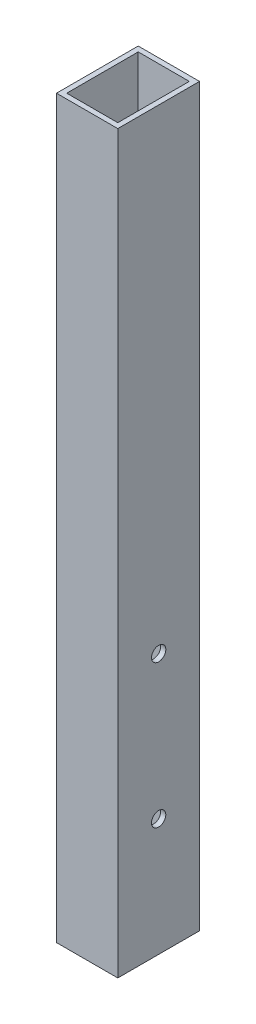
ISO-10303-21;
HEADER;
FILE_DESCRIPTION(('STEP AP214'),'2;1');
FILE_NAME('part.step','',(''),(''),'','','');
FILE_SCHEMA(('AUTOMOTIVE_DESIGN { 1 0 10303 214 1 1 1 1 }'));
ENDSEC;
DATA;
#1=APPLICATION_CONTEXT('core data for automotive mechanical design processes');
#2=APPLICATION_PROTOCOL_DEFINITION('international standard','automotive_design',2000,#1);
#3=PRODUCT_CONTEXT('',#1,'mechanical');
#4=PRODUCT('Part','Part','',(#3));
#5=PRODUCT_RELATED_PRODUCT_CATEGORY('part','',(#4));
#6=PRODUCT_DEFINITION_FORMATION('','',#4);
#7=PRODUCT_DEFINITION_CONTEXT('part definition',#1,'design');
#8=PRODUCT_DEFINITION('design','',#6,#7);
#9=PRODUCT_DEFINITION_SHAPE('','',#8);
#10=(LENGTH_UNIT() NAMED_UNIT(*) SI_UNIT(.MILLI.,.METRE.));
#11=(NAMED_UNIT(*) PLANE_ANGLE_UNIT() SI_UNIT($,.RADIAN.));
#12=(NAMED_UNIT(*) SI_UNIT($,.STERADIAN.) SOLID_ANGLE_UNIT());
#13=UNCERTAINTY_MEASURE_WITH_UNIT(LENGTH_MEASURE(1.E-05),#10,'distance_accuracy_value','');
#14=(GEOMETRIC_REPRESENTATION_CONTEXT(3) GLOBAL_UNCERTAINTY_ASSIGNED_CONTEXT((#13)) GLOBAL_UNIT_ASSIGNED_CONTEXT((#10,
#11,#12)) REPRESENTATION_CONTEXT('',''));
#15=CARTESIAN_POINT('',(0.,0.,0.));
#16=DIRECTION('',(0.,0.,1.));
#17=DIRECTION('',(1.,0.,0.));
#18=AXIS2_PLACEMENT_3D('',#15,#16,#17);
#19=CARTESIAN_POINT('',(38.1,914.4,50.8));
#20=DIRECTION('',(-1.,0.,0.));
#21=DIRECTION('',(0.,0.,1.));
#22=AXIS2_PLACEMENT_3D('',#19,#20,#21);
#23=PLANE('',#22);
#24=CARTESIAN_POINT('',(38.1,146.05,0.));
#25=DIRECTION('',(-1.,0.,0.));
#26=DIRECTION('',(0.,0.,1.));
#27=AXIS2_PLACEMENT_3D('',#24,#25,#26);
#28=CIRCLE('',#27,8.89);
#29=CARTESIAN_POINT('',(38.1,146.05,8.89));
#30=VERTEX_POINT('',#29);
#31=EDGE_CURVE('E213',#30,#30,#28,.T.);
#32=ORIENTED_EDGE('',*,*,#31,.T.);
#33=EDGE_LOOP('',(#32));
#34=FACE_BOUND('',#33,.T.);
#35=CARTESIAN_POINT('',(38.1,323.85,0.));
#36=DIRECTION('',(-1.,0.,0.));
#37=DIRECTION('',(0.,0.,1.));
#38=AXIS2_PLACEMENT_3D('',#35,#36,#37);
#39=CIRCLE('',#38,8.89);
#40=CARTESIAN_POINT('',(38.1,323.85,8.89));
#41=VERTEX_POINT('',#40);
#42=EDGE_CURVE('E226',#41,#41,#39,.T.);
#43=ORIENTED_EDGE('',*,*,#42,.T.);
#44=EDGE_LOOP('',(#43));
#45=FACE_BOUND('',#44,.T.);
#46=DIRECTION('',(0.,0.,-1.));
#47=VECTOR('',#46,1.);
#48=CARTESIAN_POINT('',(38.1,0.,50.8));
#49=LINE('',#48,#47);
#50=CARTESIAN_POINT('',(38.1,0.,50.8));
#51=VERTEX_POINT('',#50);
#52=CARTESIAN_POINT('',(38.1,0.,-50.8));
#53=VERTEX_POINT('',#52);
#54=EDGE_CURVE('E168',#51,#53,#49,.T.);
#55=ORIENTED_EDGE('',*,*,#54,.T.);
#56=DIRECTION('',(0.,-1.,0.));
#57=VECTOR('',#56,1.);
#58=CARTESIAN_POINT('',(38.1,914.4,-50.8));
#59=LINE('',#58,#57);
#60=CARTESIAN_POINT('',(38.1,914.4,-50.8));
#61=VERTEX_POINT('',#60);
#62=EDGE_CURVE('E13',#61,#53,#59,.T.);
#63=ORIENTED_EDGE('',*,*,#62,.F.);
#64=DIRECTION('',(0.,0.,-1.));
#65=VECTOR('',#64,1.);
#66=CARTESIAN_POINT('',(38.1,914.4,50.8));
#67=LINE('',#66,#65);
#68=CARTESIAN_POINT('',(38.1,914.4,50.8));
#69=VERTEX_POINT('',#68);
#70=EDGE_CURVE('E174',#69,#61,#67,.T.);
#71=ORIENTED_EDGE('',*,*,#70,.F.);
#72=DIRECTION('',(0.,-1.,0.));
#73=VECTOR('',#72,1.);
#74=CARTESIAN_POINT('',(38.1,914.4,50.8));
#75=LINE('',#74,#73);
#76=EDGE_CURVE('E188',#69,#51,#75,.T.);
#77=ORIENTED_EDGE('',*,*,#76,.T.);
#78=EDGE_LOOP('',(#55,#63,#71,#77));
#79=FACE_BOUND('',#78,.T.);
#80=ADVANCED_FACE('F55',(#34,#45,#79),#23,.F.);
#81=CARTESIAN_POINT('',(-38.1,914.4,-50.8));
#82=DIRECTION('',(0.,0.,1.));
#83=DIRECTION('',(1.,0.,0.));
#84=AXIS2_PLACEMENT_3D('',#81,#82,#83);
#85=PLANE('',#84);
#86=DIRECTION('',(-1.,0.,0.));
#87=VECTOR('',#86,1.);
#88=CARTESIAN_POINT('',(-38.1,0.,-50.8));
#89=LINE('',#88,#87);
#90=CARTESIAN_POINT('',(-38.1,0.,-50.8));
#91=VERTEX_POINT('',#90);
#92=EDGE_CURVE('E192',#53,#91,#89,.T.);
#93=ORIENTED_EDGE('',*,*,#92,.T.);
#94=DIRECTION('',(0.,-1.,0.));
#95=VECTOR('',#94,1.);
#96=CARTESIAN_POINT('',(-38.1,914.4,-50.8));
#97=LINE('',#96,#95);
#98=CARTESIAN_POINT('',(-38.1,914.4,-50.8));
#99=VERTEX_POINT('',#98);
#100=EDGE_CURVE('E64',#99,#91,#97,.T.);
#101=ORIENTED_EDGE('',*,*,#100,.F.);
#102=DIRECTION('',(-1.,0.,0.));
#103=VECTOR('',#102,1.);
#104=CARTESIAN_POINT('',(-38.1,914.4,-50.8));
#105=LINE('',#104,#103);
#106=EDGE_CURVE('E178',#61,#99,#105,.T.);
#107=ORIENTED_EDGE('',*,*,#106,.F.);
#108=ORIENTED_EDGE('',*,*,#62,.T.);
#109=EDGE_LOOP('',(#93,#101,#107,#108));
#110=FACE_BOUND('',#109,.T.);
#111=ADVANCED_FACE('F244',(#110),#85,.F.);
#112=CARTESIAN_POINT('',(-38.1,914.4,50.8));
#113=DIRECTION('',(1.,0.,0.));
#114=DIRECTION('',(0.,0.,-1.));
#115=AXIS2_PLACEMENT_3D('',#112,#113,#114);
#116=PLANE('',#115);
#117=CARTESIAN_POINT('',(-38.1,146.05,0.));
#118=DIRECTION('',(-1.,0.,0.));
#119=DIRECTION('',(0.,0.,1.));
#120=AXIS2_PLACEMENT_3D('',#117,#118,#119);
#121=CIRCLE('',#120,8.89);
#122=CARTESIAN_POINT('',(-38.1,146.05,8.89));
#123=VERTEX_POINT('',#122);
#124=EDGE_CURVE('E220',#123,#123,#121,.T.);
#125=ORIENTED_EDGE('',*,*,#124,.F.);
#126=EDGE_LOOP('',(#125));
#127=FACE_BOUND('',#126,.T.);
#128=CARTESIAN_POINT('',(-38.1,323.85,0.));
#129=DIRECTION('',(-1.,0.,0.));
#130=DIRECTION('',(0.,0.,1.));
#131=AXIS2_PLACEMENT_3D('',#128,#129,#130);
#132=CIRCLE('',#131,8.89);
#133=CARTESIAN_POINT('',(-38.1,323.85,8.89));
#134=VERTEX_POINT('',#133);
#135=EDGE_CURVE('E232',#134,#134,#132,.T.);
#136=ORIENTED_EDGE('',*,*,#135,.F.);
#137=EDGE_LOOP('',(#136));
#138=FACE_BOUND('',#137,.T.);
#139=DIRECTION('',(0.,0.,1.));
#140=VECTOR('',#139,1.);
#141=CARTESIAN_POINT('',(-38.1,0.,50.8));
#142=LINE('',#141,#140);
#143=CARTESIAN_POINT('',(-38.1,0.,50.8));
#144=VERTEX_POINT('',#143);
#145=EDGE_CURVE('E195',#91,#144,#142,.T.);
#146=ORIENTED_EDGE('',*,*,#145,.T.);
#147=DIRECTION('',(0.,-1.,0.));
#148=VECTOR('',#147,1.);
#149=CARTESIAN_POINT('',(-38.1,914.4,50.8));
#150=LINE('',#149,#148);
#151=CARTESIAN_POINT('',(-38.1,914.4,50.8));
#152=VERTEX_POINT('',#151);
#153=EDGE_CURVE('E203',#152,#144,#150,.T.);
#154=ORIENTED_EDGE('',*,*,#153,.F.);
#155=DIRECTION('',(0.,0.,1.));
#156=VECTOR('',#155,1.);
#157=CARTESIAN_POINT('',(-38.1,914.4,50.8));
#158=LINE('',#157,#156);
#159=EDGE_CURVE('E182',#99,#152,#158,.T.);
#160=ORIENTED_EDGE('',*,*,#159,.F.);
#161=ORIENTED_EDGE('',*,*,#100,.T.);
#162=EDGE_LOOP('',(#146,#154,#160,#161));
#163=FACE_BOUND('',#162,.T.);
#164=ADVANCED_FACE('F240',(#127,#138,#163),#116,.F.);
#165=CARTESIAN_POINT('',(-38.1,914.4,50.8));
#166=DIRECTION('',(0.,0.,-1.));
#167=DIRECTION('',(-1.,0.,0.));
#168=AXIS2_PLACEMENT_3D('',#165,#166,#167);
#169=PLANE('',#168);
#170=DIRECTION('',(1.,0.,0.));
#171=VECTOR('',#170,1.);
#172=CARTESIAN_POINT('',(-38.1,0.,50.8));
#173=LINE('',#172,#171);
#174=EDGE_CURVE('E179',#144,#51,#173,.T.);
#175=ORIENTED_EDGE('',*,*,#174,.T.);
#176=ORIENTED_EDGE('',*,*,#76,.F.);
#177=DIRECTION('',(1.,0.,0.));
#178=VECTOR('',#177,1.);
#179=CARTESIAN_POINT('',(-38.1,914.4,50.8));
#180=LINE('',#179,#178);
#181=EDGE_CURVE('E185',#152,#69,#180,.T.);
#182=ORIENTED_EDGE('',*,*,#181,.F.);
#183=ORIENTED_EDGE('',*,*,#153,.T.);
#184=EDGE_LOOP('',(#175,#176,#182,#183));
#185=FACE_BOUND('',#184,.T.);
#186=ADVANCED_FACE('F243',(#185),#169,.F.);
#187=CARTESIAN_POINT('',(0.,914.4,0.));
#188=DIRECTION('',(0.,-1.,0.));
#189=DIRECTION('',(0.,0.,-1.));
#190=AXIS2_PLACEMENT_3D('',#187,#188,#189);
#191=PLANE('',#190);
#192=DIRECTION('',(-1.,0.,0.));
#193=VECTOR('',#192,1.);
#194=CARTESIAN_POINT('',(-31.75,914.4,-44.45));
#195=LINE('',#194,#193);
#196=CARTESIAN_POINT('',(31.75,914.4,-44.45));
#197=VERTEX_POINT('',#196);
#198=CARTESIAN_POINT('',(-31.75,914.4,-44.45));
#199=VERTEX_POINT('',#198);
#200=EDGE_CURVE('E159',#197,#199,#195,.T.);
#201=ORIENTED_EDGE('',*,*,#200,.F.);
#202=DIRECTION('',(0.,0.,-1.));
#203=VECTOR('',#202,1.);
#204=CARTESIAN_POINT('',(31.75,914.4,44.45));
#205=LINE('',#204,#203);
#206=CARTESIAN_POINT('',(31.75,914.4,44.45));
#207=VERTEX_POINT('',#206);
#208=EDGE_CURVE('E72',#207,#197,#205,.T.);
#209=ORIENTED_EDGE('',*,*,#208,.F.);
#210=DIRECTION('',(1.,0.,0.));
#211=VECTOR('',#210,1.);
#212=CARTESIAN_POINT('',(-31.75,914.4,44.45));
#213=LINE('',#212,#211);
#214=CARTESIAN_POINT('',(-31.75,914.4,44.45));
#215=VERTEX_POINT('',#214);
#216=EDGE_CURVE('E143',#215,#207,#213,.T.);
#217=ORIENTED_EDGE('',*,*,#216,.F.);
#218=DIRECTION('',(0.,0.,1.));
#219=VECTOR('',#218,1.);
#220=CARTESIAN_POINT('',(-31.75,914.4,44.45));
#221=LINE('',#220,#219);
#222=EDGE_CURVE('E147',#199,#215,#221,.T.);
#223=ORIENTED_EDGE('',*,*,#222,.F.);
#224=EDGE_LOOP('',(#201,#209,#217,#223));
#225=FACE_BOUND('',#224,.T.);
#226=ORIENTED_EDGE('',*,*,#70,.T.);
#227=ORIENTED_EDGE('',*,*,#106,.T.);
#228=ORIENTED_EDGE('',*,*,#159,.T.);
#229=ORIENTED_EDGE('',*,*,#181,.T.);
#230=EDGE_LOOP('',(#226,#227,#228,#229));
#231=FACE_BOUND('',#230,.T.);
#232=ADVANCED_FACE('F260',(#225,#231),#191,.F.);
#233=CARTESIAN_POINT('',(0.,0.,0.));
#234=DIRECTION('',(0.,-1.,0.));
#235=DIRECTION('',(0.,0.,-1.));
#236=AXIS2_PLACEMENT_3D('',#233,#234,#235);
#237=PLANE('',#236);
#238=DIRECTION('',(0.,0.,-1.));
#239=VECTOR('',#238,1.);
#240=CARTESIAN_POINT('',(31.75,0.,44.45));
#241=LINE('',#240,#239);
#242=CARTESIAN_POINT('',(31.75,0.,44.45));
#243=VERTEX_POINT('',#242);
#244=CARTESIAN_POINT('',(31.75,0.,-44.45));
#245=VERTEX_POINT('',#244);
#246=EDGE_CURVE('E124',#243,#245,#241,.T.);
#247=ORIENTED_EDGE('',*,*,#246,.T.);
#248=DIRECTION('',(-1.,0.,0.));
#249=VECTOR('',#248,1.);
#250=CARTESIAN_POINT('',(-31.75,0.,-44.45));
#251=LINE('',#250,#249);
#252=CARTESIAN_POINT('',(-31.75,0.,-44.45));
#253=VERTEX_POINT('',#252);
#254=EDGE_CURVE('E134',#245,#253,#251,.T.);
#255=ORIENTED_EDGE('',*,*,#254,.T.);
#256=DIRECTION('',(0.,0.,1.));
#257=VECTOR('',#256,1.);
#258=CARTESIAN_POINT('',(-31.75,0.,44.45));
#259=LINE('',#258,#257);
#260=CARTESIAN_POINT('',(-31.75,0.,44.45));
#261=VERTEX_POINT('',#260);
#262=EDGE_CURVE('E80',#253,#261,#259,.T.);
#263=ORIENTED_EDGE('',*,*,#262,.T.);
#264=DIRECTION('',(1.,0.,0.));
#265=VECTOR('',#264,1.);
#266=CARTESIAN_POINT('',(-31.75,0.,44.45));
#267=LINE('',#266,#265);
#268=EDGE_CURVE('E131',#261,#243,#267,.T.);
#269=ORIENTED_EDGE('',*,*,#268,.T.);
#270=EDGE_LOOP('',(#247,#255,#263,#269));
#271=FACE_BOUND('',#270,.T.);
#272=ORIENTED_EDGE('',*,*,#54,.F.);
#273=ORIENTED_EDGE('',*,*,#174,.F.);
#274=ORIENTED_EDGE('',*,*,#145,.F.);
#275=ORIENTED_EDGE('',*,*,#92,.F.);
#276=EDGE_LOOP('',(#272,#273,#274,#275));
#277=FACE_BOUND('',#276,.T.);
#278=ADVANCED_FACE('F139',(#271,#277),#237,.T.);
#279=CARTESIAN_POINT('',(31.75,0.,44.45));
#280=DIRECTION('',(1.,0.,0.));
#281=DIRECTION('',(0.,0.,-1.));
#282=AXIS2_PLACEMENT_3D('',#279,#280,#281);
#283=PLANE('',#282);
#284=CARTESIAN_POINT('',(31.75,146.05,0.));
#285=DIRECTION('',(1.,0.,0.));
#286=DIRECTION('',(0.,0.,-1.));
#287=AXIS2_PLACEMENT_3D('',#284,#285,#286);
#288=CIRCLE('',#287,8.89);
#289=CARTESIAN_POINT('',(31.75,146.05,8.89));
#290=VERTEX_POINT('',#289);
#291=EDGE_CURVE('E150',#290,#290,#288,.T.);
#292=ORIENTED_EDGE('',*,*,#291,.T.);
#293=EDGE_LOOP('',(#292));
#294=FACE_BOUND('',#293,.T.);
#295=CARTESIAN_POINT('',(31.75,323.85,0.));
#296=DIRECTION('',(1.,0.,0.));
#297=DIRECTION('',(0.,0.,-1.));
#298=AXIS2_PLACEMENT_3D('',#295,#296,#297);
#299=CIRCLE('',#298,8.89);
#300=CARTESIAN_POINT('',(31.75,323.85,8.89));
#301=VERTEX_POINT('',#300);
#302=EDGE_CURVE('E212',#301,#301,#299,.T.);
#303=ORIENTED_EDGE('',*,*,#302,.T.);
#304=EDGE_LOOP('',(#303));
#305=FACE_BOUND('',#304,.T.);
#306=ORIENTED_EDGE('',*,*,#208,.T.);
#307=DIRECTION('',(0.,1.,0.));
#308=VECTOR('',#307,1.);
#309=CARTESIAN_POINT('',(31.75,0.,-44.45));
#310=LINE('',#309,#308);
#311=EDGE_CURVE('E120',#245,#197,#310,.T.);
#312=ORIENTED_EDGE('',*,*,#311,.F.);
#313=ORIENTED_EDGE('',*,*,#246,.F.);
#314=DIRECTION('',(0.,1.,0.));
#315=VECTOR('',#314,1.);
#316=CARTESIAN_POINT('',(31.75,0.,44.45));
#317=LINE('',#316,#315);
#318=EDGE_CURVE('E165',#243,#207,#317,.T.);
#319=ORIENTED_EDGE('',*,*,#318,.T.);
#320=EDGE_LOOP('',(#306,#312,#313,#319));
#321=FACE_BOUND('',#320,.T.);
#322=ADVANCED_FACE('F122',(#294,#305,#321),#283,.F.);
#323=CARTESIAN_POINT('',(-31.75,0.,44.45));
#324=DIRECTION('',(0.,0.,1.));
#325=DIRECTION('',(1.,0.,0.));
#326=AXIS2_PLACEMENT_3D('',#323,#324,#325);
#327=PLANE('',#326);
#328=ORIENTED_EDGE('',*,*,#216,.T.);
#329=ORIENTED_EDGE('',*,*,#318,.F.);
#330=ORIENTED_EDGE('',*,*,#268,.F.);
#331=DIRECTION('',(0.,1.,0.));
#332=VECTOR('',#331,1.);
#333=CARTESIAN_POINT('',(-31.75,0.,44.45));
#334=LINE('',#333,#332);
#335=EDGE_CURVE('E169',#261,#215,#334,.T.);
#336=ORIENTED_EDGE('',*,*,#335,.T.);
#337=EDGE_LOOP('',(#328,#329,#330,#336));
#338=FACE_BOUND('',#337,.T.);
#339=ADVANCED_FACE('F276',(#338),#327,.F.);
#340=CARTESIAN_POINT('',(-31.75,0.,44.45));
#341=DIRECTION('',(-1.,0.,0.));
#342=DIRECTION('',(0.,0.,1.));
#343=AXIS2_PLACEMENT_3D('',#340,#341,#342);
#344=PLANE('',#343);
#345=CARTESIAN_POINT('',(-31.75,146.05,0.));
#346=DIRECTION('',(-1.,0.,0.));
#347=DIRECTION('',(0.,0.,1.));
#348=AXIS2_PLACEMENT_3D('',#345,#346,#347);
#349=CIRCLE('',#348,8.89);
#350=CARTESIAN_POINT('',(-31.75,146.05,8.89));
#351=VERTEX_POINT('',#350);
#352=EDGE_CURVE('E58',#351,#351,#349,.T.);
#353=ORIENTED_EDGE('',*,*,#352,.T.);
#354=EDGE_LOOP('',(#353));
#355=FACE_BOUND('',#354,.T.);
#356=CARTESIAN_POINT('',(-31.75,323.85,0.));
#357=DIRECTION('',(-1.,0.,0.));
#358=DIRECTION('',(0.,0.,1.));
#359=AXIS2_PLACEMENT_3D('',#356,#357,#358);
#360=CIRCLE('',#359,8.89);
#361=CARTESIAN_POINT('',(-31.75,323.85,8.89));
#362=VERTEX_POINT('',#361);
#363=EDGE_CURVE('E209',#362,#362,#360,.T.);
#364=ORIENTED_EDGE('',*,*,#363,.T.);
#365=EDGE_LOOP('',(#364));
#366=FACE_BOUND('',#365,.T.);
#367=ORIENTED_EDGE('',*,*,#222,.T.);
#368=ORIENTED_EDGE('',*,*,#335,.F.);
#369=ORIENTED_EDGE('',*,*,#262,.F.);
#370=DIRECTION('',(0.,1.,0.));
#371=VECTOR('',#370,1.);
#372=CARTESIAN_POINT('',(-31.75,0.,-44.45));
#373=LINE('',#372,#371);
#374=EDGE_CURVE('E130',#253,#199,#373,.T.);
#375=ORIENTED_EDGE('',*,*,#374,.T.);
#376=EDGE_LOOP('',(#367,#368,#369,#375));
#377=FACE_BOUND('',#376,.T.);
#378=ADVANCED_FACE('F280',(#355,#366,#377),#344,.F.);
#379=CARTESIAN_POINT('',(-31.75,0.,-44.45));
#380=DIRECTION('',(0.,0.,-1.));
#381=DIRECTION('',(-1.,0.,0.));
#382=AXIS2_PLACEMENT_3D('',#379,#380,#381);
#383=PLANE('',#382);
#384=ORIENTED_EDGE('',*,*,#200,.T.);
#385=ORIENTED_EDGE('',*,*,#374,.F.);
#386=ORIENTED_EDGE('',*,*,#254,.F.);
#387=ORIENTED_EDGE('',*,*,#311,.T.);
#388=EDGE_LOOP('',(#384,#385,#386,#387));
#389=FACE_BOUND('',#388,.T.);
#390=ADVANCED_FACE('F135',(#389),#383,.F.);
#391=CARTESIAN_POINT('',(38.1,323.85,0.));
#392=DIRECTION('',(-1.,0.,0.));
#393=DIRECTION('',(0.,0.,1.));
#394=AXIS2_PLACEMENT_3D('',#391,#392,#393);
#395=CYLINDRICAL_SURFACE('',#394,8.89);
#396=CARTESIAN_POINT('',(-38.1,323.85,8.89));
#397=CARTESIAN_POINT('',(-38.0338541666667,323.85,8.89));
#398=CARTESIAN_POINT('',(-37.9677083333333,323.85,8.89));
#399=CARTESIAN_POINT('',(-37.8354166666667,323.85,8.89));
#400=CARTESIAN_POINT('',(-37.7692708333333,323.85,8.89));
#401=CARTESIAN_POINT('',(-37.6369791666667,323.85,8.89));
#402=CARTESIAN_POINT('',(-37.5708333333333,323.85,8.89));
#403=CARTESIAN_POINT('',(-37.4385416666667,323.85,8.89));
#404=CARTESIAN_POINT('',(-37.3723958333333,323.85,8.89));
#405=CARTESIAN_POINT('',(-37.2401041666667,323.85,8.89));
#406=CARTESIAN_POINT('',(-37.1739583333333,323.85,8.89));
#407=CARTESIAN_POINT('',(-37.0416666666667,323.85,8.89));
#408=CARTESIAN_POINT('',(-36.9755208333333,323.85,8.89));
#409=CARTESIAN_POINT('',(-36.8432291666667,323.85,8.89));
#410=CARTESIAN_POINT('',(-36.7770833333333,323.85,8.89));
#411=CARTESIAN_POINT('',(-36.6447916666667,323.85,8.89));
#412=CARTESIAN_POINT('',(-36.5786458333333,323.85,8.89));
#413=CARTESIAN_POINT('',(-36.4463541666667,323.85,8.89));
#414=CARTESIAN_POINT('',(-36.3802083333333,323.85,8.89));
#415=CARTESIAN_POINT('',(-36.2479166666667,323.85,8.89));
#416=CARTESIAN_POINT('',(-36.1817708333333,323.85,8.89));
#417=CARTESIAN_POINT('',(-36.0494791666667,323.85,8.89));
#418=CARTESIAN_POINT('',(-35.9833333333333,323.85,8.89));
#419=CARTESIAN_POINT('',(-35.8510416666667,323.85,8.89));
#420=CARTESIAN_POINT('',(-35.7848958333333,323.85,8.89));
#421=CARTESIAN_POINT('',(-35.6526041666667,323.85,8.89));
#422=CARTESIAN_POINT('',(-35.5864583333333,323.85,8.89));
#423=CARTESIAN_POINT('',(-35.4541666666667,323.85,8.89));
#424=CARTESIAN_POINT('',(-35.3880208333333,323.85,8.89));
#425=CARTESIAN_POINT('',(-35.2557291666667,323.85,8.89));
#426=CARTESIAN_POINT('',(-35.1895833333333,323.85,8.89));
#427=CARTESIAN_POINT('',(-35.0572916666667,323.85,8.89));
#428=CARTESIAN_POINT('',(-34.9911458333333,323.85,8.89));
#429=CARTESIAN_POINT('',(-34.8588541666667,323.85,8.89));
#430=CARTESIAN_POINT('',(-34.7927083333333,323.85,8.89));
#431=CARTESIAN_POINT('',(-34.6604166666666,323.85,8.89));
#432=CARTESIAN_POINT('',(-34.5942708333333,323.85,8.89));
#433=CARTESIAN_POINT('',(-34.4619791666667,323.85,8.89));
#434=CARTESIAN_POINT('',(-34.3958333333333,323.85,8.89));
#435=CARTESIAN_POINT('',(-34.2635416666666,323.85,8.89));
#436=CARTESIAN_POINT('',(-34.1973958333333,323.85,8.89));
#437=CARTESIAN_POINT('',(-34.0651041666666,323.85,8.89));
#438=CARTESIAN_POINT('',(-33.9989583333333,323.85,8.89));
#439=CARTESIAN_POINT('',(-33.8666666666666,323.85,8.89));
#440=CARTESIAN_POINT('',(-33.8005208333333,323.85,8.89));
#441=CARTESIAN_POINT('',(-33.6682291666666,323.85,8.89));
#442=CARTESIAN_POINT('',(-33.6020833333333,323.85,8.89));
#443=CARTESIAN_POINT('',(-33.4697916666666,323.85,8.89));
#444=CARTESIAN_POINT('',(-33.4036458333333,323.85,8.89));
#445=CARTESIAN_POINT('',(-33.2713541666666,323.85,8.89));
#446=CARTESIAN_POINT('',(-33.2052083333333,323.85,8.89));
#447=CARTESIAN_POINT('',(-33.0729166666666,323.85,8.89));
#448=CARTESIAN_POINT('',(-33.0067708333333,323.85,8.89));
#449=CARTESIAN_POINT('',(-32.8744791666666,323.85,8.89));
#450=CARTESIAN_POINT('',(-32.8083333333333,323.85,8.89));
#451=CARTESIAN_POINT('',(-32.6760416666666,323.85,8.89));
#452=CARTESIAN_POINT('',(-32.6098958333333,323.85,8.89));
#453=CARTESIAN_POINT('',(-32.4776041666666,323.85,8.89));
#454=CARTESIAN_POINT('',(-32.4114583333333,323.85,8.89));
#455=CARTESIAN_POINT('',(-32.2791666666666,323.85,8.89));
#456=CARTESIAN_POINT('',(-32.2130208333333,323.85,8.89));
#457=CARTESIAN_POINT('',(-32.0807291666666,323.85,8.89));
#458=CARTESIAN_POINT('',(-32.0145833333333,323.85,8.89));
#459=CARTESIAN_POINT('',(-31.8822916666666,323.85,8.89));
#460=CARTESIAN_POINT('',(-31.8161458333333,323.85,8.89));
#461=CARTESIAN_POINT('',(-31.75,323.85,8.89));
#462=B_SPLINE_CURVE_WITH_KNOTS('',3,(#396,#397,#398,#399,#400,#401,#402,#403,#404,#405,#406,
#407,#408,#409,#410,#411,#412,#413,#414,#415,#416,#417,#418,#419,#420,#421,#422,#423,#424,#425,
#426,#427,#428,#429,#430,#431,#432,#433,#434,#435,#436,#437,#438,#439,#440,#441,#442,#443,#444,
#445,#446,#447,#448,#449,#450,#451,#452,#453,#454,#455,#456,#457,#458,#459,#460,#461),
.UNSPECIFIED.,.F.,.F.,(4,2,2,2,2,2,2,2,2,2,2,2,2,2,2,2,2,2,2,2,2,2,2,2,2,2,2,2,2,2,2,2,4),(0.,
0.198437499999995,0.396875000000005,0.5953125,0.79375000000001,0.992187500000005,1.190625,
1.38906250000001,1.58750000000001,1.7859375,1.98437500000001,2.18281250000001,2.38125,
2.57968750000001,2.77812500000001,2.97656250000002,3.17500000000001,3.37343750000001,
3.57187500000002,3.77031250000001,3.96875000000002,4.16718750000002,4.36562500000001,
4.56406250000002,4.76250000000002,4.96093750000001,5.15937500000002,5.35781250000002,
5.55625000000001,5.75468750000002,5.95312500000002,6.15156250000003,6.35000000000002),.UNSPECIFIED.);
#463=EDGE_CURVE('BSEAM237',#134,#362,#462,.T.);
#464=ORIENTED_EDGE('',*,*,#135,.T.);
#465=ORIENTED_EDGE('',*,*,#363,.F.);
#466=ORIENTED_EDGE('',*,*,#463,.T.);
#467=ORIENTED_EDGE('',*,*,#463,.F.);
#468=EDGE_LOOP('',(#464,#466,#465,#467));
#469=FACE_BOUND('',#468,.T.);
#470=ADVANCED_FACE('F237',(#469),#395,.F.);
#471=CARTESIAN_POINT('',(38.1,146.05,0.));
#472=DIRECTION('',(-1.,0.,0.));
#473=DIRECTION('',(0.,0.,1.));
#474=AXIS2_PLACEMENT_3D('',#471,#472,#473);
#475=CYLINDRICAL_SURFACE('',#474,8.89);
#476=CARTESIAN_POINT('',(-38.1,146.05,8.89));
#477=CARTESIAN_POINT('',(-38.0338541666667,146.05,8.89));
#478=CARTESIAN_POINT('',(-37.9677083333333,146.05,8.89));
#479=CARTESIAN_POINT('',(-37.8354166666667,146.05,8.89));
#480=CARTESIAN_POINT('',(-37.7692708333333,146.05,8.89));
#481=CARTESIAN_POINT('',(-37.6369791666667,146.05,8.89));
#482=CARTESIAN_POINT('',(-37.5708333333333,146.05,8.89));
#483=CARTESIAN_POINT('',(-37.4385416666667,146.05,8.89));
#484=CARTESIAN_POINT('',(-37.3723958333333,146.05,8.89));
#485=CARTESIAN_POINT('',(-37.2401041666667,146.05,8.89));
#486=CARTESIAN_POINT('',(-37.1739583333333,146.05,8.89));
#487=CARTESIAN_POINT('',(-37.0416666666667,146.05,8.89));
#488=CARTESIAN_POINT('',(-36.9755208333333,146.05,8.89));
#489=CARTESIAN_POINT('',(-36.8432291666667,146.05,8.89));
#490=CARTESIAN_POINT('',(-36.7770833333333,146.05,8.89));
#491=CARTESIAN_POINT('',(-36.6447916666667,146.05,8.89));
#492=CARTESIAN_POINT('',(-36.5786458333333,146.05,8.89));
#493=CARTESIAN_POINT('',(-36.4463541666667,146.05,8.89));
#494=CARTESIAN_POINT('',(-36.3802083333333,146.05,8.89));
#495=CARTESIAN_POINT('',(-36.2479166666667,146.05,8.89));
#496=CARTESIAN_POINT('',(-36.1817708333333,146.05,8.89));
#497=CARTESIAN_POINT('',(-36.0494791666667,146.05,8.89));
#498=CARTESIAN_POINT('',(-35.9833333333333,146.05,8.89));
#499=CARTESIAN_POINT('',(-35.8510416666667,146.05,8.89));
#500=CARTESIAN_POINT('',(-35.7848958333333,146.05,8.89));
#501=CARTESIAN_POINT('',(-35.6526041666667,146.05,8.89));
#502=CARTESIAN_POINT('',(-35.5864583333333,146.05,8.89));
#503=CARTESIAN_POINT('',(-35.4541666666667,146.05,8.89));
#504=CARTESIAN_POINT('',(-35.3880208333333,146.05,8.89));
#505=CARTESIAN_POINT('',(-35.2557291666667,146.05,8.89));
#506=CARTESIAN_POINT('',(-35.1895833333333,146.05,8.89));
#507=CARTESIAN_POINT('',(-35.0572916666667,146.05,8.89));
#508=CARTESIAN_POINT('',(-34.9911458333333,146.05,8.89));
#509=CARTESIAN_POINT('',(-34.8588541666667,146.05,8.89));
#510=CARTESIAN_POINT('',(-34.7927083333333,146.05,8.89));
#511=CARTESIAN_POINT('',(-34.6604166666666,146.05,8.89));
#512=CARTESIAN_POINT('',(-34.5942708333333,146.05,8.89));
#513=CARTESIAN_POINT('',(-34.4619791666667,146.05,8.89));
#514=CARTESIAN_POINT('',(-34.3958333333333,146.05,8.89));
#515=CARTESIAN_POINT('',(-34.2635416666666,146.05,8.89));
#516=CARTESIAN_POINT('',(-34.1973958333333,146.05,8.89));
#517=CARTESIAN_POINT('',(-34.0651041666666,146.05,8.89));
#518=CARTESIAN_POINT('',(-33.9989583333333,146.05,8.89));
#519=CARTESIAN_POINT('',(-33.8666666666666,146.05,8.89));
#520=CARTESIAN_POINT('',(-33.8005208333333,146.05,8.89));
#521=CARTESIAN_POINT('',(-33.6682291666666,146.05,8.89));
#522=CARTESIAN_POINT('',(-33.6020833333333,146.05,8.89));
#523=CARTESIAN_POINT('',(-33.4697916666666,146.05,8.89));
#524=CARTESIAN_POINT('',(-33.4036458333333,146.05,8.89));
#525=CARTESIAN_POINT('',(-33.2713541666666,146.05,8.89));
#526=CARTESIAN_POINT('',(-33.2052083333333,146.05,8.89));
#527=CARTESIAN_POINT('',(-33.0729166666666,146.05,8.89));
#528=CARTESIAN_POINT('',(-33.0067708333333,146.05,8.89));
#529=CARTESIAN_POINT('',(-32.8744791666666,146.05,8.89));
#530=CARTESIAN_POINT('',(-32.8083333333333,146.05,8.89));
#531=CARTESIAN_POINT('',(-32.6760416666666,146.05,8.89));
#532=CARTESIAN_POINT('',(-32.6098958333333,146.05,8.89));
#533=CARTESIAN_POINT('',(-32.4776041666666,146.05,8.89));
#534=CARTESIAN_POINT('',(-32.4114583333333,146.05,8.89));
#535=CARTESIAN_POINT('',(-32.2791666666666,146.05,8.89));
#536=CARTESIAN_POINT('',(-32.2130208333333,146.05,8.89));
#537=CARTESIAN_POINT('',(-32.0807291666666,146.05,8.89));
#538=CARTESIAN_POINT('',(-32.0145833333333,146.05,8.89));
#539=CARTESIAN_POINT('',(-31.8822916666666,146.05,8.89));
#540=CARTESIAN_POINT('',(-31.8161458333333,146.05,8.89));
#541=CARTESIAN_POINT('',(-31.75,146.05,8.89));
#542=B_SPLINE_CURVE_WITH_KNOTS('',3,(#476,#477,#478,#479,#480,#481,#482,#483,#484,#485,#486,
#487,#488,#489,#490,#491,#492,#493,#494,#495,#496,#497,#498,#499,#500,#501,#502,#503,#504,#505,
#506,#507,#508,#509,#510,#511,#512,#513,#514,#515,#516,#517,#518,#519,#520,#521,#522,#523,#524,
#525,#526,#527,#528,#529,#530,#531,#532,#533,#534,#535,#536,#537,#538,#539,#540,#541),
.UNSPECIFIED.,.F.,.F.,(4,2,2,2,2,2,2,2,2,2,2,2,2,2,2,2,2,2,2,2,2,2,2,2,2,2,2,2,2,2,2,2,4),(0.,
0.198437499999995,0.396875000000005,0.5953125,0.79375000000001,0.992187500000005,1.190625,
1.38906250000001,1.58750000000001,1.7859375,1.98437500000001,2.18281250000001,2.38125,
2.57968750000001,2.77812500000001,2.97656250000002,3.17500000000001,3.37343750000001,
3.57187500000002,3.77031250000001,3.96875000000002,4.16718750000002,4.36562500000001,
4.56406250000002,4.76250000000002,4.96093750000001,5.15937500000002,5.35781250000002,
5.55625000000001,5.75468750000002,5.95312500000002,6.15156250000003,6.35000000000002),.UNSPECIFIED.);
#543=EDGE_CURVE('BSEAM291',#123,#351,#542,.T.);
#544=ORIENTED_EDGE('',*,*,#124,.T.);
#545=ORIENTED_EDGE('',*,*,#352,.F.);
#546=ORIENTED_EDGE('',*,*,#543,.T.);
#547=ORIENTED_EDGE('',*,*,#543,.F.);
#548=EDGE_LOOP('',(#544,#546,#545,#547));
#549=FACE_BOUND('',#548,.T.);
#550=ADVANCED_FACE('F291',(#549),#475,.F.);
#551=CARTESIAN_POINT('',(38.1,323.85,8.89));
#552=CARTESIAN_POINT('',(38.0338541666667,323.85,8.89));
#553=CARTESIAN_POINT('',(37.9677083333333,323.85,8.89));
#554=CARTESIAN_POINT('',(37.8354166666667,323.85,8.89));
#555=CARTESIAN_POINT('',(37.7692708333333,323.85,8.89));
#556=CARTESIAN_POINT('',(37.6369791666667,323.85,8.89));
#557=CARTESIAN_POINT('',(37.5708333333333,323.85,8.89));
#558=CARTESIAN_POINT('',(37.4385416666667,323.85,8.89));
#559=CARTESIAN_POINT('',(37.3723958333333,323.85,8.89));
#560=CARTESIAN_POINT('',(37.2401041666667,323.85,8.89));
#561=CARTESIAN_POINT('',(37.1739583333333,323.85,8.89));
#562=CARTESIAN_POINT('',(37.0416666666667,323.85,8.89));
#563=CARTESIAN_POINT('',(36.9755208333333,323.85,8.89));
#564=CARTESIAN_POINT('',(36.8432291666667,323.85,8.89));
#565=CARTESIAN_POINT('',(36.7770833333333,323.85,8.89));
#566=CARTESIAN_POINT('',(36.6447916666667,323.85,8.89));
#567=CARTESIAN_POINT('',(36.5786458333333,323.85,8.89));
#568=CARTESIAN_POINT('',(36.4463541666667,323.85,8.89));
#569=CARTESIAN_POINT('',(36.3802083333333,323.85,8.89));
#570=CARTESIAN_POINT('',(36.2479166666667,323.85,8.89));
#571=CARTESIAN_POINT('',(36.1817708333333,323.85,8.89));
#572=CARTESIAN_POINT('',(36.0494791666667,323.85,8.89));
#573=CARTESIAN_POINT('',(35.9833333333333,323.85,8.89));
#574=CARTESIAN_POINT('',(35.8510416666667,323.85,8.89));
#575=CARTESIAN_POINT('',(35.7848958333333,323.85,8.89));
#576=CARTESIAN_POINT('',(35.6526041666667,323.85,8.89));
#577=CARTESIAN_POINT('',(35.5864583333333,323.85,8.89));
#578=CARTESIAN_POINT('',(35.4541666666667,323.85,8.89));
#579=CARTESIAN_POINT('',(35.3880208333333,323.85,8.89));
#580=CARTESIAN_POINT('',(35.2557291666667,323.85,8.89));
#581=CARTESIAN_POINT('',(35.1895833333333,323.85,8.89));
#582=CARTESIAN_POINT('',(35.0572916666667,323.85,8.89));
#583=CARTESIAN_POINT('',(34.9911458333333,323.85,8.89));
#584=CARTESIAN_POINT('',(34.8588541666667,323.85,8.89));
#585=CARTESIAN_POINT('',(34.7927083333333,323.85,8.89));
#586=CARTESIAN_POINT('',(34.6604166666667,323.85,8.89));
#587=CARTESIAN_POINT('',(34.5942708333333,323.85,8.89));
#588=CARTESIAN_POINT('',(34.4619791666667,323.85,8.89));
#589=CARTESIAN_POINT('',(34.3958333333333,323.85,8.89));
#590=CARTESIAN_POINT('',(34.2635416666667,323.85,8.89));
#591=CARTESIAN_POINT('',(34.1973958333333,323.85,8.89));
#592=CARTESIAN_POINT('',(34.0651041666667,323.85,8.89));
#593=CARTESIAN_POINT('',(33.9989583333333,323.85,8.89));
#594=CARTESIAN_POINT('',(33.8666666666667,323.85,8.89));
#595=CARTESIAN_POINT('',(33.8005208333333,323.85,8.89));
#596=CARTESIAN_POINT('',(33.6682291666667,323.85,8.89));
#597=CARTESIAN_POINT('',(33.6020833333333,323.85,8.89));
#598=CARTESIAN_POINT('',(33.4697916666667,323.85,8.89));
#599=CARTESIAN_POINT('',(33.4036458333333,323.85,8.89));
#600=CARTESIAN_POINT('',(33.2713541666667,323.85,8.89));
#601=CARTESIAN_POINT('',(33.2052083333333,323.85,8.89));
#602=CARTESIAN_POINT('',(33.0729166666667,323.85,8.89));
#603=CARTESIAN_POINT('',(33.0067708333333,323.85,8.89));
#604=CARTESIAN_POINT('',(32.8744791666667,323.85,8.89));
#605=CARTESIAN_POINT('',(32.8083333333333,323.85,8.89));
#606=CARTESIAN_POINT('',(32.6760416666667,323.85,8.89));
#607=CARTESIAN_POINT('',(32.6098958333333,323.85,8.89));
#608=CARTESIAN_POINT('',(32.4776041666667,323.85,8.89));
#609=CARTESIAN_POINT('',(32.4114583333333,323.85,8.89));
#610=CARTESIAN_POINT('',(32.2791666666667,323.85,8.89));
#611=CARTESIAN_POINT('',(32.2130208333333,323.85,8.89));
#612=CARTESIAN_POINT('',(32.0807291666667,323.85,8.89));
#613=CARTESIAN_POINT('',(32.0145833333333,323.85,8.89));
#614=CARTESIAN_POINT('',(31.8822916666667,323.85,8.89));
#615=CARTESIAN_POINT('',(31.8161458333333,323.85,8.89));
#616=CARTESIAN_POINT('',(31.75,323.85,8.89));
#617=B_SPLINE_CURVE_WITH_KNOTS('',3,(#551,#552,#553,#554,#555,#556,#557,#558,#559,#560,#561,
#562,#563,#564,#565,#566,#567,#568,#569,#570,#571,#572,#573,#574,#575,#576,#577,#578,#579,#580,
#581,#582,#583,#584,#585,#586,#587,#588,#589,#590,#591,#592,#593,#594,#595,#596,#597,#598,#599,
#600,#601,#602,#603,#604,#605,#606,#607,#608,#609,#610,#611,#612,#613,#614,#615,#616),
.UNSPECIFIED.,.F.,.F.,(4,2,2,2,2,2,2,2,2,2,2,2,2,2,2,2,2,2,2,2,2,2,2,2,2,2,2,2,2,2,2,2,4),(0.,
0.198437499999995,0.396874999999998,0.5953125,0.793749999999996,0.992187499999998,1.190625,
1.3890625,1.5875,1.7859375,1.984375,2.1828125,2.38125,2.5796875,2.778125,2.9765625,3.175,
3.3734375,3.571875,3.7703125,3.96875,4.1671875,4.365625,4.5640625,4.7625,4.96093750000001,
5.159375,5.3578125,5.55625000000001,5.7546875,5.953125,6.15156250000001,6.35),.UNSPECIFIED.);
#618=EDGE_CURVE('BSEAM287',#41,#301,#617,.T.);
#619=ORIENTED_EDGE('',*,*,#42,.F.);
#620=ORIENTED_EDGE('',*,*,#302,.F.);
#621=ORIENTED_EDGE('',*,*,#618,.T.);
#622=ORIENTED_EDGE('',*,*,#618,.F.);
#623=EDGE_LOOP('',(#619,#621,#620,#622));
#624=FACE_BOUND('',#623,.T.);
#625=ADVANCED_FACE('F287',(#624),#395,.F.);
#626=CARTESIAN_POINT('',(38.1,146.05,8.89));
#627=CARTESIAN_POINT('',(38.0338541666667,146.05,8.89));
#628=CARTESIAN_POINT('',(37.9677083333333,146.05,8.89));
#629=CARTESIAN_POINT('',(37.8354166666667,146.05,8.89));
#630=CARTESIAN_POINT('',(37.7692708333333,146.05,8.89));
#631=CARTESIAN_POINT('',(37.6369791666667,146.05,8.89));
#632=CARTESIAN_POINT('',(37.5708333333333,146.05,8.89));
#633=CARTESIAN_POINT('',(37.4385416666667,146.05,8.89));
#634=CARTESIAN_POINT('',(37.3723958333333,146.05,8.89));
#635=CARTESIAN_POINT('',(37.2401041666667,146.05,8.89));
#636=CARTESIAN_POINT('',(37.1739583333333,146.05,8.89));
#637=CARTESIAN_POINT('',(37.0416666666667,146.05,8.89));
#638=CARTESIAN_POINT('',(36.9755208333333,146.05,8.89));
#639=CARTESIAN_POINT('',(36.8432291666667,146.05,8.89));
#640=CARTESIAN_POINT('',(36.7770833333333,146.05,8.89));
#641=CARTESIAN_POINT('',(36.6447916666667,146.05,8.89));
#642=CARTESIAN_POINT('',(36.5786458333333,146.05,8.89));
#643=CARTESIAN_POINT('',(36.4463541666667,146.05,8.89));
#644=CARTESIAN_POINT('',(36.3802083333333,146.05,8.89));
#645=CARTESIAN_POINT('',(36.2479166666667,146.05,8.89));
#646=CARTESIAN_POINT('',(36.1817708333333,146.05,8.89));
#647=CARTESIAN_POINT('',(36.0494791666667,146.05,8.89));
#648=CARTESIAN_POINT('',(35.9833333333333,146.05,8.89));
#649=CARTESIAN_POINT('',(35.8510416666667,146.05,8.89));
#650=CARTESIAN_POINT('',(35.7848958333333,146.05,8.89));
#651=CARTESIAN_POINT('',(35.6526041666667,146.05,8.89));
#652=CARTESIAN_POINT('',(35.5864583333333,146.05,8.89));
#653=CARTESIAN_POINT('',(35.4541666666667,146.05,8.89));
#654=CARTESIAN_POINT('',(35.3880208333333,146.05,8.89));
#655=CARTESIAN_POINT('',(35.2557291666667,146.05,8.89));
#656=CARTESIAN_POINT('',(35.1895833333333,146.05,8.89));
#657=CARTESIAN_POINT('',(35.0572916666667,146.05,8.89));
#658=CARTESIAN_POINT('',(34.9911458333333,146.05,8.89));
#659=CARTESIAN_POINT('',(34.8588541666667,146.05,8.89));
#660=CARTESIAN_POINT('',(34.7927083333333,146.05,8.89));
#661=CARTESIAN_POINT('',(34.6604166666667,146.05,8.89));
#662=CARTESIAN_POINT('',(34.5942708333333,146.05,8.89));
#663=CARTESIAN_POINT('',(34.4619791666667,146.05,8.89));
#664=CARTESIAN_POINT('',(34.3958333333333,146.05,8.89));
#665=CARTESIAN_POINT('',(34.2635416666667,146.05,8.89));
#666=CARTESIAN_POINT('',(34.1973958333333,146.05,8.89));
#667=CARTESIAN_POINT('',(34.0651041666667,146.05,8.89));
#668=CARTESIAN_POINT('',(33.9989583333333,146.05,8.89));
#669=CARTESIAN_POINT('',(33.8666666666667,146.05,8.89));
#670=CARTESIAN_POINT('',(33.8005208333333,146.05,8.89));
#671=CARTESIAN_POINT('',(33.6682291666667,146.05,8.89));
#672=CARTESIAN_POINT('',(33.6020833333333,146.05,8.89));
#673=CARTESIAN_POINT('',(33.4697916666667,146.05,8.89));
#674=CARTESIAN_POINT('',(33.4036458333333,146.05,8.89));
#675=CARTESIAN_POINT('',(33.2713541666667,146.05,8.89));
#676=CARTESIAN_POINT('',(33.2052083333333,146.05,8.89));
#677=CARTESIAN_POINT('',(33.0729166666667,146.05,8.89));
#678=CARTESIAN_POINT('',(33.0067708333333,146.05,8.89));
#679=CARTESIAN_POINT('',(32.8744791666667,146.05,8.89));
#680=CARTESIAN_POINT('',(32.8083333333333,146.05,8.89));
#681=CARTESIAN_POINT('',(32.6760416666667,146.05,8.89));
#682=CARTESIAN_POINT('',(32.6098958333333,146.05,8.89));
#683=CARTESIAN_POINT('',(32.4776041666667,146.05,8.89));
#684=CARTESIAN_POINT('',(32.4114583333333,146.05,8.89));
#685=CARTESIAN_POINT('',(32.2791666666667,146.05,8.89));
#686=CARTESIAN_POINT('',(32.2130208333333,146.05,8.89));
#687=CARTESIAN_POINT('',(32.0807291666667,146.05,8.89));
#688=CARTESIAN_POINT('',(32.0145833333333,146.05,8.89));
#689=CARTESIAN_POINT('',(31.8822916666667,146.05,8.89));
#690=CARTESIAN_POINT('',(31.8161458333333,146.05,8.89));
#691=CARTESIAN_POINT('',(31.75,146.05,8.89));
#692=B_SPLINE_CURVE_WITH_KNOTS('',3,(#626,#627,#628,#629,#630,#631,#632,#633,#634,#635,#636,
#637,#638,#639,#640,#641,#642,#643,#644,#645,#646,#647,#648,#649,#650,#651,#652,#653,#654,#655,
#656,#657,#658,#659,#660,#661,#662,#663,#664,#665,#666,#667,#668,#669,#670,#671,#672,#673,#674,
#675,#676,#677,#678,#679,#680,#681,#682,#683,#684,#685,#686,#687,#688,#689,#690,#691),
.UNSPECIFIED.,.F.,.F.,(4,2,2,2,2,2,2,2,2,2,2,2,2,2,2,2,2,2,2,2,2,2,2,2,2,2,2,2,2,2,2,2,4),(0.,
0.198437499999995,0.396874999999998,0.5953125,0.793749999999996,0.992187499999998,1.190625,
1.3890625,1.5875,1.7859375,1.984375,2.1828125,2.38125,2.5796875,2.778125,2.9765625,3.175,
3.3734375,3.571875,3.7703125,3.96875,4.1671875,4.365625,4.5640625,4.7625,4.96093750000001,
5.159375,5.3578125,5.55625000000001,5.7546875,5.953125,6.15156250000001,6.35),.UNSPECIFIED.);
#693=EDGE_CURVE('BSEAM290',#30,#290,#692,.T.);
#694=ORIENTED_EDGE('',*,*,#31,.F.);
#695=ORIENTED_EDGE('',*,*,#291,.F.);
#696=ORIENTED_EDGE('',*,*,#693,.T.);
#697=ORIENTED_EDGE('',*,*,#693,.F.);
#698=EDGE_LOOP('',(#694,#696,#695,#697));
#699=FACE_BOUND('',#698,.T.);
#700=ADVANCED_FACE('F290',(#699),#475,.F.);
#701=CLOSED_SHELL('',(#80,#111,#164,#186,#232,#278,#322,#339,#378,#390,#470,#550,#625,#700));
#702=MANIFOLD_SOLID_BREP('B2',#701);
#703=ADVANCED_BREP_SHAPE_REPRESENTATION('',(#18,#702),#14);
#704=SHAPE_DEFINITION_REPRESENTATION(#9,#703);
ENDSEC;
END-ISO-10303-21;
